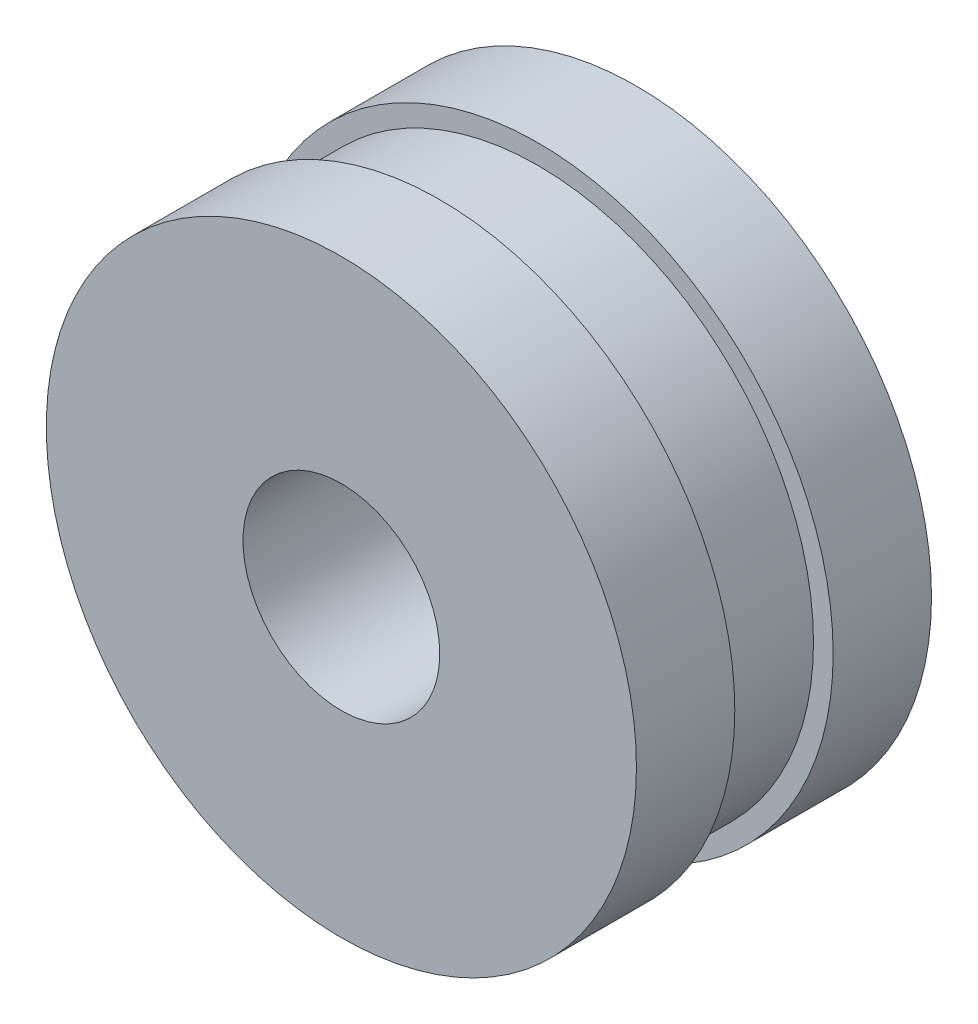
ISO-10303-21;
HEADER;
FILE_DESCRIPTION(('STEP AP214'),'2;1');
FILE_NAME('part.step','',(''),(''),'','','');
FILE_SCHEMA(('AUTOMOTIVE_DESIGN { 1 0 10303 214 1 1 1 1 }'));
ENDSEC;
DATA;
#1=APPLICATION_CONTEXT('core data for automotive mechanical design processes');
#2=APPLICATION_PROTOCOL_DEFINITION('international standard','automotive_design',2000,#1);
#3=PRODUCT_CONTEXT('',#1,'mechanical');
#4=PRODUCT('Part','Part','',(#3));
#5=PRODUCT_RELATED_PRODUCT_CATEGORY('part','',(#4));
#6=PRODUCT_DEFINITION_FORMATION('','',#4);
#7=PRODUCT_DEFINITION_CONTEXT('part definition',#1,'design');
#8=PRODUCT_DEFINITION('design','',#6,#7);
#9=PRODUCT_DEFINITION_SHAPE('','',#8);
#10=(LENGTH_UNIT() NAMED_UNIT(*) SI_UNIT(.MILLI.,.METRE.));
#11=(NAMED_UNIT(*) PLANE_ANGLE_UNIT() SI_UNIT($,.RADIAN.));
#12=(NAMED_UNIT(*) SI_UNIT($,.STERADIAN.) SOLID_ANGLE_UNIT());
#13=UNCERTAINTY_MEASURE_WITH_UNIT(LENGTH_MEASURE(1.E-05),#10,'distance_accuracy_value','');
#14=(GEOMETRIC_REPRESENTATION_CONTEXT(3) GLOBAL_UNCERTAINTY_ASSIGNED_CONTEXT((#13)) GLOBAL_UNIT_ASSIGNED_CONTEXT((#10,
#11,#12)) REPRESENTATION_CONTEXT('',''));
#15=CARTESIAN_POINT('',(0.,0.,0.));
#16=DIRECTION('',(0.,0.,1.));
#17=DIRECTION('',(1.,0.,0.));
#18=AXIS2_PLACEMENT_3D('',#15,#16,#17);
#19=CARTESIAN_POINT('',(0.,0.,-1.5));
#20=DIRECTION('',(0.,0.,1.));
#21=DIRECTION('',(1.,0.,0.));
#22=AXIS2_PLACEMENT_3D('',#19,#20,#21);
#23=CYLINDRICAL_SURFACE('',#22,3.);
#24=CARTESIAN_POINT('',(0.,0.,-1.5));
#25=DIRECTION('',(0.,0.,1.));
#26=DIRECTION('',(1.,0.,0.));
#27=AXIS2_PLACEMENT_3D('',#24,#25,#26);
#28=CIRCLE('',#27,3.);
#29=CARTESIAN_POINT('',(3.,0.,-1.5));
#30=VERTEX_POINT('',#29);
#31=EDGE_CURVE('E10',#30,#30,#28,.T.);
#32=ORIENTED_EDGE('',*,*,#31,.T.);
#33=EDGE_LOOP('',(#32));
#34=FACE_BOUND('',#33,.T.);
#35=CARTESIAN_POINT('',(0.,0.,-0.5));
#36=DIRECTION('',(0.,0.,1.));
#37=DIRECTION('',(1.,0.,0.));
#38=AXIS2_PLACEMENT_3D('',#35,#36,#37);
#39=CIRCLE('',#38,3.);
#40=CARTESIAN_POINT('',(3.,0.,-0.5));
#41=VERTEX_POINT('',#40);
#42=EDGE_CURVE('E69',#41,#41,#39,.T.);
#43=ORIENTED_EDGE('',*,*,#42,.F.);
#44=EDGE_LOOP('',(#43));
#45=FACE_BOUND('',#44,.T.);
#46=ADVANCED_FACE('F37',(#34,#45),#23,.T.);
#47=CARTESIAN_POINT('',(0.,0.,0.5));
#48=DIRECTION('',(0.,0.,1.));
#49=DIRECTION('',(1.,0.,0.));
#50=AXIS2_PLACEMENT_3D('',#47,#48,#49);
#51=CIRCLE('',#50,3.);
#52=CARTESIAN_POINT('',(3.,0.,0.5));
#53=VERTEX_POINT('',#52);
#54=EDGE_CURVE('E61',#53,#53,#51,.T.);
#55=ORIENTED_EDGE('',*,*,#54,.T.);
#56=EDGE_LOOP('',(#55));
#57=FACE_BOUND('',#56,.T.);
#58=CARTESIAN_POINT('',(0.,0.,1.5));
#59=DIRECTION('',(0.,0.,1.));
#60=DIRECTION('',(1.,0.,0.));
#61=AXIS2_PLACEMENT_3D('',#58,#59,#60);
#62=CIRCLE('',#61,3.);
#63=CARTESIAN_POINT('',(3.,0.,1.5));
#64=VERTEX_POINT('',#63);
#65=EDGE_CURVE('E50',#64,#64,#62,.T.);
#66=ORIENTED_EDGE('',*,*,#65,.F.);
#67=EDGE_LOOP('',(#66));
#68=FACE_BOUND('',#67,.T.);
#69=ADVANCED_FACE('F39',(#57,#68),#23,.T.);
#70=CARTESIAN_POINT('',(0.,0.,-1.5));
#71=DIRECTION('',(0.,0.,1.));
#72=DIRECTION('',(1.,0.,0.));
#73=AXIS2_PLACEMENT_3D('',#70,#71,#72);
#74=PLANE('',#73);
#75=CARTESIAN_POINT('',(0.,0.,-1.5));
#76=DIRECTION('',(0.,0.,1.));
#77=DIRECTION('',(1.,0.,0.));
#78=AXIS2_PLACEMENT_3D('',#75,#76,#77);
#79=CIRCLE('',#78,1.);
#80=CARTESIAN_POINT('',(1.,0.,-1.5));
#81=VERTEX_POINT('',#80);
#82=EDGE_CURVE('E45',#81,#81,#79,.T.);
#83=ORIENTED_EDGE('',*,*,#82,.T.);
#84=EDGE_LOOP('',(#83));
#85=FACE_BOUND('',#84,.T.);
#86=ORIENTED_EDGE('',*,*,#31,.F.);
#87=EDGE_LOOP('',(#86));
#88=FACE_BOUND('',#87,.T.);
#89=ADVANCED_FACE('F90',(#85,#88),#74,.F.);
#90=CARTESIAN_POINT('',(0.,0.,-1.5));
#91=DIRECTION('',(0.,0.,1.));
#92=DIRECTION('',(1.,0.,0.));
#93=AXIS2_PLACEMENT_3D('',#90,#91,#92);
#94=CYLINDRICAL_SURFACE('',#93,1.);
#95=ORIENTED_EDGE('',*,*,#82,.F.);
#96=EDGE_LOOP('',(#95));
#97=FACE_BOUND('',#96,.T.);
#98=CARTESIAN_POINT('',(0.,0.,1.5));
#99=DIRECTION('',(0.,0.,1.));
#100=DIRECTION('',(1.,0.,0.));
#101=AXIS2_PLACEMENT_3D('',#98,#99,#100);
#102=CIRCLE('',#101,1.);
#103=CARTESIAN_POINT('',(1.,0.,1.5));
#104=VERTEX_POINT('',#103);
#105=EDGE_CURVE('E55',#104,#104,#102,.T.);
#106=ORIENTED_EDGE('',*,*,#105,.T.);
#107=EDGE_LOOP('',(#106));
#108=FACE_BOUND('',#107,.T.);
#109=ADVANCED_FACE('F95',(#97,#108),#94,.F.);
#110=CARTESIAN_POINT('',(0.,0.,1.5));
#111=DIRECTION('',(0.,0.,1.));
#112=DIRECTION('',(1.,0.,0.));
#113=AXIS2_PLACEMENT_3D('',#110,#111,#112);
#114=PLANE('',#113);
#115=ORIENTED_EDGE('',*,*,#65,.T.);
#116=EDGE_LOOP('',(#115));
#117=FACE_BOUND('',#116,.T.);
#118=ORIENTED_EDGE('',*,*,#105,.F.);
#119=EDGE_LOOP('',(#118));
#120=FACE_BOUND('',#119,.T.);
#121=ADVANCED_FACE('F100',(#117,#120),#114,.T.);
#122=CARTESIAN_POINT('',(0.,0.,0.5));
#123=DIRECTION('',(0.,0.,1.));
#124=DIRECTION('',(1.,0.,0.));
#125=AXIS2_PLACEMENT_3D('',#122,#123,#124);
#126=PLANE('',#125);
#127=ORIENTED_EDGE('',*,*,#54,.F.);
#128=EDGE_LOOP('',(#127));
#129=FACE_BOUND('',#128,.T.);
#130=CARTESIAN_POINT('',(0.,0.,0.5));
#131=DIRECTION('',(0.,0.,1.));
#132=DIRECTION('',(1.,0.,0.));
#133=AXIS2_PLACEMENT_3D('',#130,#131,#132);
#134=CIRCLE('',#133,2.8);
#135=CARTESIAN_POINT('',(2.8,0.,0.5));
#136=VERTEX_POINT('',#135);
#137=EDGE_CURVE('E65',#136,#136,#134,.T.);
#138=ORIENTED_EDGE('',*,*,#137,.T.);
#139=EDGE_LOOP('',(#138));
#140=FACE_BOUND('',#139,.T.);
#141=ADVANCED_FACE('F103',(#129,#140),#126,.F.);
#142=CARTESIAN_POINT('',(0.,0.,0.5));
#143=DIRECTION('',(0.,0.,-1.));
#144=DIRECTION('',(-1.,0.,0.));
#145=AXIS2_PLACEMENT_3D('',#142,#143,#144);
#146=CYLINDRICAL_SURFACE('',#145,2.8);
#147=ORIENTED_EDGE('',*,*,#137,.F.);
#148=EDGE_LOOP('',(#147));
#149=FACE_BOUND('',#148,.T.);
#150=CARTESIAN_POINT('',(0.,0.,-0.5));
#151=DIRECTION('',(0.,0.,1.));
#152=DIRECTION('',(1.,0.,0.));
#153=AXIS2_PLACEMENT_3D('',#150,#151,#152);
#154=CIRCLE('',#153,2.8);
#155=CARTESIAN_POINT('',(2.8,0.,-0.5));
#156=VERTEX_POINT('',#155);
#157=EDGE_CURVE('E73',#156,#156,#154,.T.);
#158=ORIENTED_EDGE('',*,*,#157,.T.);
#159=EDGE_LOOP('',(#158));
#160=FACE_BOUND('',#159,.T.);
#161=ADVANCED_FACE('F78',(#149,#160),#146,.T.);
#162=CARTESIAN_POINT('',(0.,0.,-0.5));
#163=DIRECTION('',(0.,0.,1.));
#164=DIRECTION('',(1.,0.,0.));
#165=AXIS2_PLACEMENT_3D('',#162,#163,#164);
#166=PLANE('',#165);
#167=ORIENTED_EDGE('',*,*,#157,.F.);
#168=EDGE_LOOP('',(#167));
#169=FACE_BOUND('',#168,.T.);
#170=ORIENTED_EDGE('',*,*,#42,.T.);
#171=EDGE_LOOP('',(#170));
#172=FACE_BOUND('',#171,.T.);
#173=ADVANCED_FACE('F80',(#169,#172),#166,.T.);
#174=CLOSED_SHELL('',(#46,#69,#89,#109,#121,#141,#161,#173));
#175=MANIFOLD_SOLID_BREP('B2',#174);
#176=ADVANCED_BREP_SHAPE_REPRESENTATION('',(#18,#175),#14);
#177=SHAPE_DEFINITION_REPRESENTATION(#9,#176);
ENDSEC;
END-ISO-10303-21;
